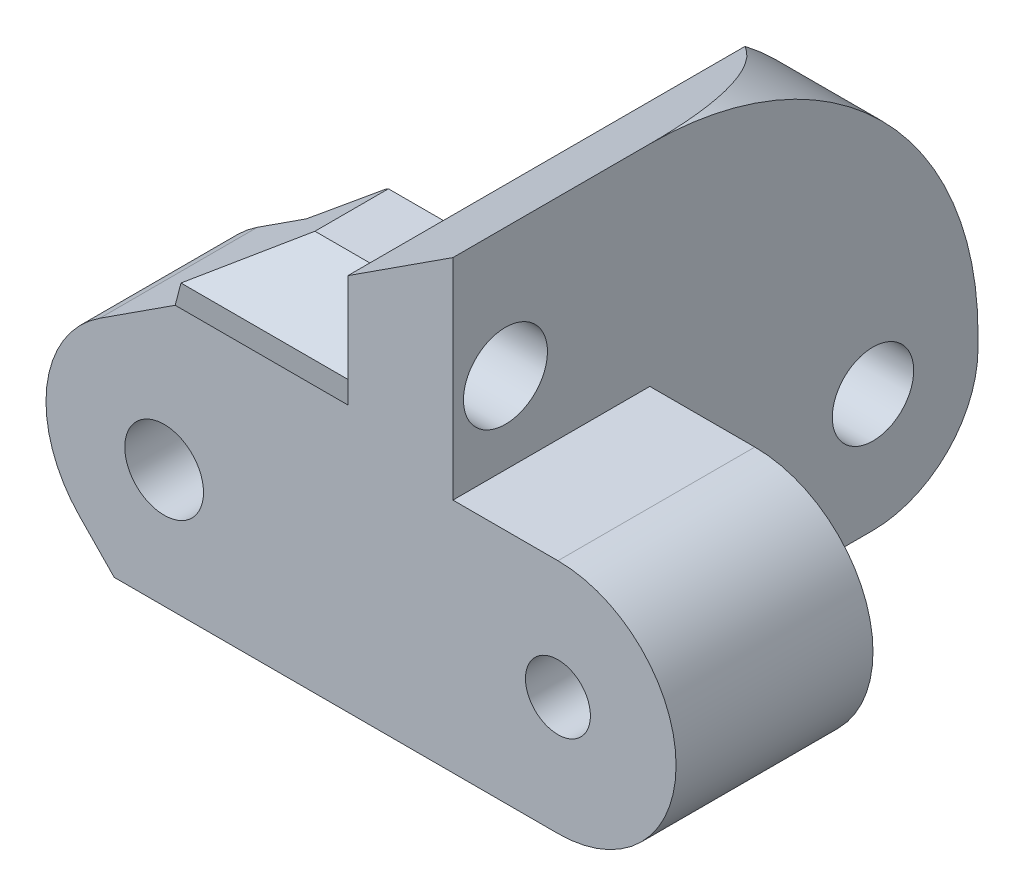
ISO-10303-21;
HEADER;
FILE_DESCRIPTION(('STEP AP214'),'2;1');
FILE_NAME('part.step','',(''),(''),'','','');
FILE_SCHEMA(('AUTOMOTIVE_DESIGN { 1 0 10303 214 1 1 1 1 }'));
ENDSEC;
DATA;
#1=APPLICATION_CONTEXT('core data for automotive mechanical design processes');
#2=APPLICATION_PROTOCOL_DEFINITION('international standard','automotive_design',2000,#1);
#3=PRODUCT_CONTEXT('',#1,'mechanical');
#4=PRODUCT('Part','Part','',(#3));
#5=PRODUCT_RELATED_PRODUCT_CATEGORY('part','',(#4));
#6=PRODUCT_DEFINITION_FORMATION('','',#4);
#7=PRODUCT_DEFINITION_CONTEXT('part definition',#1,'design');
#8=PRODUCT_DEFINITION('design','',#6,#7);
#9=PRODUCT_DEFINITION_SHAPE('','',#8);
#10=(LENGTH_UNIT() NAMED_UNIT(*) SI_UNIT(.MILLI.,.METRE.));
#11=(NAMED_UNIT(*) PLANE_ANGLE_UNIT() SI_UNIT($,.RADIAN.));
#12=(NAMED_UNIT(*) SI_UNIT($,.STERADIAN.) SOLID_ANGLE_UNIT());
#13=UNCERTAINTY_MEASURE_WITH_UNIT(LENGTH_MEASURE(1.E-05),#10,'distance_accuracy_value','');
#14=(GEOMETRIC_REPRESENTATION_CONTEXT(3) GLOBAL_UNCERTAINTY_ASSIGNED_CONTEXT((#13)) GLOBAL_UNIT_ASSIGNED_CONTEXT((#10,
#11,#12)) REPRESENTATION_CONTEXT('',''));
#15=CARTESIAN_POINT('',(0.,0.,0.));
#16=DIRECTION('',(0.,0.,1.));
#17=DIRECTION('',(1.,0.,0.));
#18=AXIS2_PLACEMENT_3D('',#15,#16,#17);
#19=CARTESIAN_POINT('',(15.,0.,20.));
#20=DIRECTION('',(0.,0.,-1.));
#21=DIRECTION('',(-1.,0.,0.));
#22=AXIS2_PLACEMENT_3D('',#19,#20,#21);
#23=CYLINDRICAL_SURFACE('',#22,1.23677362201173);
#24=CARTESIAN_POINT('',(15.,0.,20.));
#25=DIRECTION('',(0.,0.,1.));
#26=DIRECTION('',(1.,0.,0.));
#27=AXIS2_PLACEMENT_3D('',#24,#25,#26);
#28=CIRCLE('',#27,1.23677362201173);
#29=CARTESIAN_POINT('',(16.2367736220117,0.,20.));
#30=VERTEX_POINT('',#29);
#31=EDGE_CURVE('E452',#30,#30,#28,.T.);
#32=ORIENTED_EDGE('',*,*,#31,.T.);
#33=EDGE_LOOP('',(#32));
#34=FACE_BOUND('',#33,.T.);
#35=CARTESIAN_POINT('',(15.,0.,17.));
#36=DIRECTION('',(0.,0.,-1.));
#37=DIRECTION('',(-1.,0.,0.));
#38=AXIS2_PLACEMENT_3D('',#35,#36,#37);
#39=CIRCLE('',#38,1.23677362201173);
#40=CARTESIAN_POINT('',(13.7632263779883,0.,17.));
#41=VERTEX_POINT('',#40);
#42=EDGE_CURVE('E334',#41,#41,#39,.T.);
#43=ORIENTED_EDGE('',*,*,#42,.T.);
#44=EDGE_LOOP('',(#43));
#45=FACE_BOUND('',#44,.T.);
#46=ADVANCED_FACE('F43',(#34,#45),#23,.F.);
#47=CARTESIAN_POINT('',(11.,12.5,20.));
#48=DIRECTION('',(0.544238933358043,-0.838930261355078,0.));
#49=DIRECTION('',(0.838930261355078,0.544238933358043,0.));
#50=AXIS2_PLACEMENT_3D('',#47,#48,#49);
#51=PLANE('',#50);
#52=DIRECTION('',(-0.642711462780688,-0.416945981178167,0.642711462780682));
#53=VECTOR('',#52,1.);
#54=CARTESIAN_POINT('',(-0.683724830096396,4.92042130068163,14.096011589825));
#55=LINE('',#54,#53);
#56=CARTESIAN_POINT('',(0.912286759728581,5.95580133795719,12.5));
#57=VERTEX_POINT('',#56);
#58=CARTESIAN_POINT('',(-0.587713240271441,4.98270686557702,14.));
#59=VERTEX_POINT('',#58);
#60=EDGE_CURVE('E524',#57,#59,#55,.T.);
#61=ORIENTED_EDGE('',*,*,#60,.T.);
#62=DIRECTION('',(-0.838930261355078,-0.544238933358043,0.));
#63=VECTOR('',#62,1.);
#64=CARTESIAN_POINT('',(11.,12.5,14.));
#65=LINE('',#64,#63);
#66=CARTESIAN_POINT('',(-2.44907520011119,3.77518617609785,14.));
#67=VERTEX_POINT('',#66);
#68=EDGE_CURVE('E445',#59,#67,#65,.T.);
#69=ORIENTED_EDGE('',*,*,#68,.T.);
#70=DIRECTION('',(0.,0.,-1.));
#71=VECTOR('',#70,1.);
#72=CARTESIAN_POINT('',(-2.44907520011119,3.77518617609785,20.));
#73=LINE('',#72,#71);
#74=CARTESIAN_POINT('',(-2.44907520011119,3.77518617609785,20.));
#75=VERTEX_POINT('',#74);
#76=EDGE_CURVE('E494',#75,#67,#73,.T.);
#77=ORIENTED_EDGE('',*,*,#76,.F.);
#78=DIRECTION('',(-0.838930261355078,-0.544238933358043,0.));
#79=VECTOR('',#78,1.);
#80=CARTESIAN_POINT('',(11.,12.5,20.));
#81=LINE('',#80,#79);
#82=CARTESIAN_POINT('',(0.420876733903177,5.63700908475527,20.));
#83=VERTEX_POINT('',#82);
#84=EDGE_CURVE('E459',#83,#75,#81,.T.);
#85=ORIENTED_EDGE('',*,*,#84,.F.);
#86=DIRECTION('',(-0.610460041142624,-0.396023527763233,-0.685932871078584));
#87=VECTOR('',#86,1.);
#88=CARTESIAN_POINT('',(6.02248120635965,9.27093598382683,26.2941460201832));
#89=LINE('',#88,#87);
#90=CARTESIAN_POINT('',(-1.35906432704266,4.48230854637602,18.));
#91=VERTEX_POINT('',#90);
#92=EDGE_CURVE('E499',#83,#91,#89,.T.);
#93=ORIENTED_EDGE('',*,*,#92,.T.);
#94=DIRECTION('',(0.610460041142625,0.396023527763233,-0.685932871078584));
#95=VECTOR('',#94,1.);
#96=CARTESIAN_POINT('',(4.34754277156082,8.18435376217362,11.5878695943213));
#97=LINE('',#96,#95);
#98=CARTESIAN_POINT('',(1.04385610523424,6.04115427318801,15.3));
#99=VERTEX_POINT('',#98);
#100=EDGE_CURVE('E506',#91,#99,#97,.T.);
#101=ORIENTED_EDGE('',*,*,#100,.T.);
#102=DIRECTION('',(0.,0.,-1.));
#103=VECTOR('',#102,1.);
#104=CARTESIAN_POINT('',(1.04385610523424,6.04115427318801,20.));
#105=LINE('',#104,#103);
#106=CARTESIAN_POINT('',(1.04385610523425,6.04115427318801,12.5));
#107=VERTEX_POINT('',#106);
#108=EDGE_CURVE('E509',#99,#107,#105,.T.);
#109=ORIENTED_EDGE('',*,*,#108,.T.);
#110=DIRECTION('',(0.838930261355078,0.544238933358043,0.));
#111=VECTOR('',#110,1.);
#112=CARTESIAN_POINT('',(11.,12.5,12.5));
#113=LINE('',#112,#111);
#114=EDGE_CURVE('E375',#57,#107,#113,.T.);
#115=ORIENTED_EDGE('',*,*,#114,.F.);
#116=EDGE_LOOP('',(#61,#69,#77,#85,#93,#101,#109,#115));
#117=FACE_BOUND('',#116,.T.);
#118=ADVANCED_FACE('F558',(#117),#51,.F.);
#119=CARTESIAN_POINT('',(1.58771324027147,-2.75,14.));
#120=DIRECTION('',(0.,-1.,0.));
#121=DIRECTION('',(0.,0.,-1.));
#122=AXIS2_PLACEMENT_3D('',#119,#120,#121);
#123=PLANE('',#122);
#124=DIRECTION('',(1.,0.,0.));
#125=VECTOR('',#124,1.);
#126=CARTESIAN_POINT('',(1.58771324027147,-2.75,12.5));
#127=LINE('',#126,#125);
#128=CARTESIAN_POINT('',(0.912286759728574,-2.75,12.5));
#129=VERTEX_POINT('',#128);
#130=CARTESIAN_POINT('',(1.58771324027147,-2.75,12.5));
#131=VERTEX_POINT('',#130);
#132=EDGE_CURVE('E373',#129,#131,#127,.T.);
#133=ORIENTED_EDGE('',*,*,#132,.F.);
#134=DIRECTION('',(-0.707106781186551,0.,0.707106781186544));
#135=VECTOR('',#134,1.);
#136=CARTESIAN_POINT('',(0.912286759728573,-2.75,12.5));
#137=LINE('',#136,#135);
#138=CARTESIAN_POINT('',(-0.587713240271442,-2.75,14.));
#139=VERTEX_POINT('',#138);
#140=EDGE_CURVE('E520',#129,#139,#137,.T.);
#141=ORIENTED_EDGE('',*,*,#140,.T.);
#142=DIRECTION('',(-1.,0.,0.));
#143=VECTOR('',#142,1.);
#144=CARTESIAN_POINT('',(1.58771324027147,-2.75,14.));
#145=LINE('',#144,#143);
#146=CARTESIAN_POINT('',(1.58771324027147,-2.75,14.));
#147=VERTEX_POINT('',#146);
#148=EDGE_CURVE('E422',#147,#139,#145,.T.);
#149=ORIENTED_EDGE('',*,*,#148,.F.);
#150=DIRECTION('',(0.,0.,-1.));
#151=VECTOR('',#150,1.);
#152=CARTESIAN_POINT('',(1.58771324027147,-2.75,14.));
#153=LINE('',#152,#151);
#154=EDGE_CURVE('E426',#147,#131,#153,.T.);
#155=ORIENTED_EDGE('',*,*,#154,.T.);
#156=EDGE_LOOP('',(#133,#141,#149,#155));
#157=FACE_BOUND('',#156,.T.);
#158=ADVANCED_FACE('F564',(#157),#123,.F.);
#159=CARTESIAN_POINT('',(3.17542648054294,0.,14.));
#160=DIRECTION('',(0.866025403784439,-0.5,0.));
#161=DIRECTION('',(0.5,0.866025403784439,0.));
#162=AXIS2_PLACEMENT_3D('',#159,#160,#161);
#163=PLANE('',#162);
#164=DIRECTION('',(0.5,0.866025403784439,0.));
#165=VECTOR('',#164,1.);
#166=CARTESIAN_POINT('',(3.17542648054294,0.,12.5));
#167=LINE('',#166,#165);
#168=CARTESIAN_POINT('',(3.17542648054294,0.,12.5));
#169=VERTEX_POINT('',#168);
#170=EDGE_CURVE('E371',#131,#169,#167,.T.);
#171=ORIENTED_EDGE('',*,*,#170,.F.);
#172=ORIENTED_EDGE('',*,*,#154,.F.);
#173=DIRECTION('',(-0.5,-0.866025403784439,0.));
#174=VECTOR('',#173,1.);
#175=CARTESIAN_POINT('',(3.17542648054294,0.,14.));
#176=LINE('',#175,#174);
#177=CARTESIAN_POINT('',(3.17542648054294,0.,14.));
#178=VERTEX_POINT('',#177);
#179=EDGE_CURVE('E419',#178,#147,#176,.T.);
#180=ORIENTED_EDGE('',*,*,#179,.F.);
#181=DIRECTION('',(0.,0.,-1.));
#182=VECTOR('',#181,1.);
#183=CARTESIAN_POINT('',(3.17542648054294,0.,14.));
#184=LINE('',#183,#182);
#185=EDGE_CURVE('E430',#178,#169,#184,.T.);
#186=ORIENTED_EDGE('',*,*,#185,.T.);
#187=EDGE_LOOP('',(#171,#172,#180,#186));
#188=FACE_BOUND('',#187,.T.);
#189=ADVANCED_FACE('F641',(#188),#163,.F.);
#190=CARTESIAN_POINT('',(1.58771324027147,2.75,14.));
#191=DIRECTION('',(0.866025403784439,0.5,0.));
#192=DIRECTION('',(-0.5,0.866025403784439,0.));
#193=AXIS2_PLACEMENT_3D('',#190,#191,#192);
#194=PLANE('',#193);
#195=DIRECTION('',(-0.5,0.866025403784439,0.));
#196=VECTOR('',#195,1.);
#197=CARTESIAN_POINT('',(1.58771324027147,2.75,12.5));
#198=LINE('',#197,#196);
#199=CARTESIAN_POINT('',(1.58771324027147,2.75,12.5));
#200=VERTEX_POINT('',#199);
#201=EDGE_CURVE('E369',#169,#200,#198,.T.);
#202=ORIENTED_EDGE('',*,*,#201,.F.);
#203=ORIENTED_EDGE('',*,*,#185,.F.);
#204=DIRECTION('',(0.5,-0.866025403784439,0.));
#205=VECTOR('',#204,1.);
#206=CARTESIAN_POINT('',(1.58771324027147,2.75,14.));
#207=LINE('',#206,#205);
#208=CARTESIAN_POINT('',(1.58771324027147,2.75,14.));
#209=VERTEX_POINT('',#208);
#210=EDGE_CURVE('E416',#209,#178,#207,.T.);
#211=ORIENTED_EDGE('',*,*,#210,.F.);
#212=DIRECTION('',(0.,0.,-1.));
#213=VECTOR('',#212,1.);
#214=CARTESIAN_POINT('',(1.58771324027147,2.75,14.));
#215=LINE('',#214,#213);
#216=EDGE_CURVE('E425',#209,#200,#215,.T.);
#217=ORIENTED_EDGE('',*,*,#216,.T.);
#218=EDGE_LOOP('',(#202,#203,#211,#217));
#219=FACE_BOUND('',#218,.T.);
#220=ADVANCED_FACE('F637',(#219),#194,.F.);
#221=CARTESIAN_POINT('',(-1.58771324027147,2.75,14.));
#222=DIRECTION('',(0.,1.,0.));
#223=DIRECTION('',(-1.,0.,0.));
#224=AXIS2_PLACEMENT_3D('',#221,#222,#223);
#225=PLANE('',#224);
#226=DIRECTION('',(1.,0.,0.));
#227=VECTOR('',#226,1.);
#228=CARTESIAN_POINT('',(-1.58771324027147,2.75,14.));
#229=LINE('',#228,#227);
#230=CARTESIAN_POINT('',(-0.587713240271442,2.75,14.));
#231=VERTEX_POINT('',#230);
#232=EDGE_CURVE('E414',#231,#209,#229,.T.);
#233=ORIENTED_EDGE('',*,*,#232,.F.);
#234=DIRECTION('',(0.707106781186551,0.,-0.707106781186544));
#235=VECTOR('',#234,1.);
#236=CARTESIAN_POINT('',(0.912286759728574,2.75,12.5));
#237=LINE('',#236,#235);
#238=CARTESIAN_POINT('',(0.912286759728573,2.75,12.5));
#239=VERTEX_POINT('',#238);
#240=EDGE_CURVE('E527',#231,#239,#237,.T.);
#241=ORIENTED_EDGE('',*,*,#240,.T.);
#242=DIRECTION('',(-1.,0.,0.));
#243=VECTOR('',#242,1.);
#244=CARTESIAN_POINT('',(-1.58771324027147,2.75,12.5));
#245=LINE('',#244,#243);
#246=EDGE_CURVE('E363',#200,#239,#245,.T.);
#247=ORIENTED_EDGE('',*,*,#246,.F.);
#248=ORIENTED_EDGE('',*,*,#216,.F.);
#249=EDGE_LOOP('',(#233,#241,#247,#248));
#250=FACE_BOUND('',#249,.T.);
#251=ADVANCED_FACE('F581',(#250),#225,.F.);
#252=CARTESIAN_POINT('',(15.,0.,20.));
#253=DIRECTION('',(0.,0.,1.));
#254=DIRECTION('',(1.,0.,0.));
#255=AXIS2_PLACEMENT_3D('',#252,#253,#254);
#256=PLANE('',#255);
#257=DIRECTION('',(1.,0.,0.));
#258=VECTOR('',#257,1.);
#259=CARTESIAN_POINT('',(-4.5,5.63700908475527,20.));
#260=LINE('',#259,#258);
#261=CARTESIAN_POINT('',(7.,5.63700908475527,20.));
#262=VERTEX_POINT('',#261);
#263=EDGE_CURVE('E405',#83,#262,#260,.T.);
#264=ORIENTED_EDGE('',*,*,#263,.F.);
#265=ORIENTED_EDGE('',*,*,#84,.T.);
#266=CARTESIAN_POINT('',(0.,0.,20.));
#267=DIRECTION('',(0.,0.,1.));
#268=DIRECTION('',(1.,0.,0.));
#269=AXIS2_PLACEMENT_3D('',#266,#267,#268);
#270=CIRCLE('',#269,4.5);
#271=CARTESIAN_POINT('',(-3.22716747151166,-3.13614255269385,20.));
#272=VERTEX_POINT('',#271);
#273=EDGE_CURVE('E463',#75,#272,#270,.T.);
#274=ORIENTED_EDGE('',*,*,#273,.T.);
#275=DIRECTION('',(0.696920567265299,-0.71714832700259,0.));
#276=VECTOR('',#275,1.);
#277=CARTESIAN_POINT('',(-3.22716747151166,-3.13614255269385,20.));
#278=LINE('',#277,#276);
#279=CARTESIAN_POINT('',(-1.90177874778927,-4.5,20.));
#280=VERTEX_POINT('',#279);
#281=EDGE_CURVE('E466',#272,#280,#278,.T.);
#282=ORIENTED_EDGE('',*,*,#281,.T.);
#283=DIRECTION('',(1.,0.,0.));
#284=VECTOR('',#283,1.);
#285=CARTESIAN_POINT('',(-1.90177874778927,-4.5,20.));
#286=LINE('',#285,#284);
#287=CARTESIAN_POINT('',(15.,-4.5,20.));
#288=VERTEX_POINT('',#287);
#289=EDGE_CURVE('E468',#280,#288,#286,.T.);
#290=ORIENTED_EDGE('',*,*,#289,.T.);
#291=CARTESIAN_POINT('',(15.,0.,20.));
#292=DIRECTION('',(0.,0.,1.));
#293=DIRECTION('',(1.,0.,0.));
#294=AXIS2_PLACEMENT_3D('',#291,#292,#293);
#295=CIRCLE('',#294,4.5);
#296=CARTESIAN_POINT('',(15.,4.5,20.));
#297=VERTEX_POINT('',#296);
#298=EDGE_CURVE('E471',#288,#297,#295,.T.);
#299=ORIENTED_EDGE('',*,*,#298,.T.);
#300=DIRECTION('',(-1.,0.,0.));
#301=VECTOR('',#300,1.);
#302=CARTESIAN_POINT('',(15.,4.5,20.));
#303=LINE('',#302,#301);
#304=CARTESIAN_POINT('',(11.,4.5,20.));
#305=VERTEX_POINT('',#304);
#306=EDGE_CURVE('E473',#297,#305,#303,.T.);
#307=ORIENTED_EDGE('',*,*,#306,.T.);
#308=DIRECTION('',(0.,1.,0.));
#309=VECTOR('',#308,1.);
#310=CARTESIAN_POINT('',(11.,12.5,20.));
#311=LINE('',#310,#309);
#312=CARTESIAN_POINT('',(11.,12.5,20.));
#313=VERTEX_POINT('',#312);
#314=EDGE_CURVE('E260',#305,#313,#311,.T.);
#315=ORIENTED_EDGE('',*,*,#314,.T.);
#316=CARTESIAN_POINT('',(7.,9.90508140698625,20.));
#317=VERTEX_POINT('',#316);
#318=EDGE_CURVE('E460',#313,#317,#81,.T.);
#319=ORIENTED_EDGE('',*,*,#318,.T.);
#320=DIRECTION('',(0.,-1.,0.));
#321=VECTOR('',#320,1.);
#322=CARTESIAN_POINT('',(7.,11.8723919920032,20.));
#323=LINE('',#322,#321);
#324=EDGE_CURVE('E393',#317,#262,#323,.T.);
#325=ORIENTED_EDGE('',*,*,#324,.T.);
#326=EDGE_LOOP('',(#264,#265,#274,#282,#290,#299,#307,#315,#319,#325));
#327=FACE_BOUND('',#326,.T.);
#328=CARTESIAN_POINT('',(0.,0.,20.));
#329=DIRECTION('',(0.,0.,1.));
#330=DIRECTION('',(1.,0.,0.));
#331=AXIS2_PLACEMENT_3D('',#328,#329,#330);
#332=CIRCLE('',#331,1.5);
#333=CARTESIAN_POINT('',(1.5,0.,20.));
#334=VERTEX_POINT('',#333);
#335=EDGE_CURVE('E261',#334,#334,#332,.T.);
#336=ORIENTED_EDGE('',*,*,#335,.F.);
#337=EDGE_LOOP('',(#336));
#338=FACE_BOUND('',#337,.T.);
#339=ORIENTED_EDGE('',*,*,#31,.F.);
#340=EDGE_LOOP('',(#339));
#341=FACE_BOUND('',#340,.T.);
#342=ADVANCED_FACE('F578',(#327,#338,#341),#256,.T.);
#343=CARTESIAN_POINT('',(15.,0.,0.));
#344=DIRECTION('',(0.,0.,1.));
#345=DIRECTION('',(1.,0.,0.));
#346=AXIS2_PLACEMENT_3D('',#343,#344,#345);
#347=PLANE('',#346);
#348=DIRECTION('',(0.,1.,0.));
#349=VECTOR('',#348,1.);
#350=CARTESIAN_POINT('',(11.,12.5,0.));
#351=LINE('',#350,#349);
#352=CARTESIAN_POINT('',(11.,-0.5,0.));
#353=VERTEX_POINT('',#352);
#354=CARTESIAN_POINT('',(11.,0.,0.));
#355=VERTEX_POINT('',#354);
#356=EDGE_CURVE('E253',#353,#355,#351,.T.);
#357=ORIENTED_EDGE('',*,*,#356,.F.);
#358=DIRECTION('',(1.,0.,0.));
#359=VECTOR('',#358,1.);
#360=CARTESIAN_POINT('',(15.,-0.5,0.));
#361=LINE('',#360,#359);
#362=CARTESIAN_POINT('',(5.5,-0.5,0.));
#363=VERTEX_POINT('',#362);
#364=EDGE_CURVE('E58',#353,#363,#361,.F.);
#365=ORIENTED_EDGE('',*,*,#364,.T.);
#366=DIRECTION('',(0.,-1.,0.));
#367=VECTOR('',#366,1.);
#368=CARTESIAN_POINT('',(5.5,6.04115427318802,0.));
#369=LINE('',#368,#367);
#370=CARTESIAN_POINT('',(5.5,0.,0.));
#371=VERTEX_POINT('',#370);
#372=EDGE_CURVE('E273',#371,#363,#369,.T.);
#373=ORIENTED_EDGE('',*,*,#372,.F.);
#374=DIRECTION('',(-1.,0.,0.));
#375=VECTOR('',#374,1.);
#376=CARTESIAN_POINT('',(19.5,0.,0.));
#377=LINE('',#376,#375);
#378=EDGE_CURVE('E265',#355,#371,#377,.T.);
#379=ORIENTED_EDGE('',*,*,#378,.F.);
#380=EDGE_LOOP('',(#357,#365,#373,#379));
#381=FACE_BOUND('',#380,.T.);
#382=ADVANCED_FACE('F272',(#381),#347,.F.);
#383=CARTESIAN_POINT('',(11.,12.5,20.));
#384=DIRECTION('',(-1.,0.,0.));
#385=DIRECTION('',(0.,-1.,0.));
#386=AXIS2_PLACEMENT_3D('',#383,#384,#385);
#387=PLANE('',#386);
#388=CARTESIAN_POINT('',(11.,0.,4.));
#389=DIRECTION('',(-1.,0.,0.));
#390=DIRECTION('',(0.,-1.,0.));
#391=AXIS2_PLACEMENT_3D('',#388,#389,#390);
#392=CIRCLE('',#391,1.55);
#393=CARTESIAN_POINT('',(11.,-1.55,4.));
#394=VERTEX_POINT('',#393);
#395=EDGE_CURVE('E280',#394,#394,#392,.T.);
#396=ORIENTED_EDGE('',*,*,#395,.T.);
#397=EDGE_LOOP('',(#396));
#398=FACE_BOUND('',#397,.T.);
#399=CARTESIAN_POINT('',(11.,7.6,18.));
#400=DIRECTION('',(1.,0.,0.));
#401=DIRECTION('',(0.,1.,0.));
#402=AXIS2_PLACEMENT_3D('',#399,#400,#401);
#403=CIRCLE('',#402,1.6);
#404=CARTESIAN_POINT('',(11.,9.2,18.));
#405=VERTEX_POINT('',#404);
#406=EDGE_CURVE('E448',#405,#405,#403,.T.);
#407=ORIENTED_EDGE('',*,*,#406,.F.);
#408=EDGE_LOOP('',(#407));
#409=FACE_BOUND('',#408,.T.);
#410=DIRECTION('',(0.,0.,-1.));
#411=VECTOR('',#410,1.);
#412=CARTESIAN_POINT('',(11.,-4.5,12.5));
#413=LINE('',#412,#411);
#414=CARTESIAN_POINT('',(11.,-4.5,12.5));
#415=VERTEX_POINT('',#414);
#416=CARTESIAN_POINT('',(11.,-4.5,4.));
#417=VERTEX_POINT('',#416);
#418=EDGE_CURVE('E387',#415,#417,#413,.T.);
#419=ORIENTED_EDGE('',*,*,#418,.T.);
#420=CARTESIAN_POINT('',(11.,-0.5,4.));
#421=DIRECTION('',(-1.,0.,0.));
#422=DIRECTION('',(0.,-1.,0.));
#423=AXIS2_PLACEMENT_3D('',#420,#421,#422);
#424=CIRCLE('',#423,4.);
#425=EDGE_CURVE('E66',#417,#353,#424,.F.);
#426=ORIENTED_EDGE('',*,*,#425,.T.);
#427=ORIENTED_EDGE('',*,*,#356,.T.);
#428=CARTESIAN_POINT('',(11.,0.,12.5));
#429=DIRECTION('',(-1.,0.,0.));
#430=DIRECTION('',(0.,-1.,0.));
#431=AXIS2_PLACEMENT_3D('',#428,#429,#430);
#432=CIRCLE('',#431,12.5);
#433=CARTESIAN_POINT('',(11.,12.5,12.5));
#434=VERTEX_POINT('',#433);
#435=EDGE_CURVE('E257',#355,#434,#432,.F.);
#436=ORIENTED_EDGE('',*,*,#435,.T.);
#437=DIRECTION('',(0.,0.,-1.));
#438=VECTOR('',#437,1.);
#439=CARTESIAN_POINT('',(11.,12.5,20.));
#440=LINE('',#439,#438);
#441=EDGE_CURVE('E497',#313,#434,#440,.T.);
#442=ORIENTED_EDGE('',*,*,#441,.F.);
#443=ORIENTED_EDGE('',*,*,#314,.F.);
#444=DIRECTION('',(0.,0.,-1.));
#445=VECTOR('',#444,1.);
#446=CARTESIAN_POINT('',(11.,4.5,20.));
#447=LINE('',#446,#445);
#448=CARTESIAN_POINT('',(11.,4.5,12.5));
#449=VERTEX_POINT('',#448);
#450=EDGE_CURVE('E474',#305,#449,#447,.T.);
#451=ORIENTED_EDGE('',*,*,#450,.T.);
#452=DIRECTION('',(0.,1.,0.));
#453=VECTOR('',#452,1.);
#454=CARTESIAN_POINT('',(11.,4.5,12.5));
#455=LINE('',#454,#453);
#456=EDGE_CURVE('E377',#415,#449,#455,.T.);
#457=ORIENTED_EDGE('',*,*,#456,.F.);
#458=EDGE_LOOP('',(#419,#426,#427,#436,#442,#443,#451,#457));
#459=FACE_BOUND('',#458,.T.);
#460=ADVANCED_FACE('F255',(#398,#409,#459),#387,.F.);
#461=ORIENTED_EDGE('',*,*,#441,.T.);
#462=CARTESIAN_POINT('',(-8.26842720022668,0.,12.5));
#463=DIRECTION('',(0.544238933358043,-0.838930261355078,0.));
#464=DIRECTION('',(-0.838930261355078,-0.544238933358043,0.));
#465=AXIS2_PLACEMENT_3D('',#462,#463,#464);
#466=ELLIPSE('',#465,22.967853333963,12.5);
#467=CARTESIAN_POINT('',(7.,9.90508140698625,4.87508279907413));
#468=VERTEX_POINT('',#467);
#469=EDGE_CURVE('E268',#434,#468,#466,.F.);
#470=ORIENTED_EDGE('',*,*,#469,.T.);
#471=DIRECTION('',(0.,0.,1.));
#472=VECTOR('',#471,1.);
#473=CARTESIAN_POINT('',(7.,9.90508140698625,20.));
#474=LINE('',#473,#472);
#475=EDGE_CURVE('E412',#468,#317,#474,.T.);
#476=ORIENTED_EDGE('',*,*,#475,.T.);
#477=ORIENTED_EDGE('',*,*,#318,.F.);
#478=EDGE_LOOP('',(#461,#470,#476,#477));
#479=FACE_BOUND('',#478,.T.);
#480=ADVANCED_FACE('F567',(#479),#51,.F.);
#481=CARTESIAN_POINT('',(0.,0.,20.));
#482=DIRECTION('',(0.,0.,-1.));
#483=DIRECTION('',(-1.,0.,0.));
#484=AXIS2_PLACEMENT_3D('',#481,#482,#483);
#485=CYLINDRICAL_SURFACE('',#484,4.5);
#486=ORIENTED_EDGE('',*,*,#76,.T.);
#487=CARTESIAN_POINT('',(0.,0.,14.));
#488=DIRECTION('',(0.,0.,1.));
#489=DIRECTION('',(1.,0.,0.));
#490=AXIS2_PLACEMENT_3D('',#487,#488,#489);
#491=CIRCLE('',#490,4.5);
#492=CARTESIAN_POINT('',(-3.22716747151166,-3.13614255269385,14.));
#493=VERTEX_POINT('',#492);
#494=EDGE_CURVE('E441',#67,#493,#491,.T.);
#495=ORIENTED_EDGE('',*,*,#494,.T.);
#496=DIRECTION('',(0.,0.,-1.));
#497=VECTOR('',#496,1.);
#498=CARTESIAN_POINT('',(-3.22716747151166,-3.13614255269385,20.));
#499=LINE('',#498,#497);
#500=EDGE_CURVE('E490',#272,#493,#499,.T.);
#501=ORIENTED_EDGE('',*,*,#500,.F.);
#502=ORIENTED_EDGE('',*,*,#273,.F.);
#503=EDGE_LOOP('',(#486,#495,#501,#502));
#504=FACE_BOUND('',#503,.T.);
#505=ADVANCED_FACE('F599',(#504),#485,.T.);
#506=CARTESIAN_POINT('',(-3.22716747151166,-3.13614255269385,20.));
#507=DIRECTION('',(0.71714832700259,0.696920567265299,0.));
#508=DIRECTION('',(-0.696920567265299,0.71714832700259,0.));
#509=AXIS2_PLACEMENT_3D('',#506,#507,#508);
#510=PLANE('',#509);
#511=ORIENTED_EDGE('',*,*,#500,.T.);
#512=DIRECTION('',(0.696920567265299,-0.71714832700259,0.));
#513=VECTOR('',#512,1.);
#514=CARTESIAN_POINT('',(-3.22716747151166,-3.13614255269385,14.));
#515=LINE('',#514,#513);
#516=CARTESIAN_POINT('',(-1.90177874778927,-4.5,14.));
#517=VERTEX_POINT('',#516);
#518=EDGE_CURVE('E437',#493,#517,#515,.T.);
#519=ORIENTED_EDGE('',*,*,#518,.T.);
#520=DIRECTION('',(0.,0.,-1.));
#521=VECTOR('',#520,1.);
#522=CARTESIAN_POINT('',(-1.90177874778927,-4.5,20.));
#523=LINE('',#522,#521);
#524=EDGE_CURVE('E487',#280,#517,#523,.T.);
#525=ORIENTED_EDGE('',*,*,#524,.F.);
#526=ORIENTED_EDGE('',*,*,#281,.F.);
#527=EDGE_LOOP('',(#511,#519,#525,#526));
#528=FACE_BOUND('',#527,.T.);
#529=ADVANCED_FACE('F595',(#528),#510,.F.);
#530=CARTESIAN_POINT('',(-1.90177874778927,-4.5,20.));
#531=DIRECTION('',(0.,1.,0.));
#532=DIRECTION('',(0.,0.,1.));
#533=AXIS2_PLACEMENT_3D('',#530,#531,#532);
#534=PLANE('',#533);
#535=DIRECTION('',(0.,0.,-1.));
#536=VECTOR('',#535,1.);
#537=CARTESIAN_POINT('',(5.5,-4.5,12.5));
#538=LINE('',#537,#536);
#539=CARTESIAN_POINT('',(5.5,-4.5,12.5));
#540=VERTEX_POINT('',#539);
#541=CARTESIAN_POINT('',(5.5,-4.5,4.));
#542=VERTEX_POINT('',#541);
#543=EDGE_CURVE('E358',#540,#542,#538,.T.);
#544=ORIENTED_EDGE('',*,*,#543,.T.);
#545=DIRECTION('',(1.,0.,0.));
#546=VECTOR('',#545,1.);
#547=CARTESIAN_POINT('',(-1.90177874778927,-4.5,4.));
#548=LINE('',#547,#546);
#549=EDGE_CURVE('E534',#542,#417,#548,.T.);
#550=ORIENTED_EDGE('',*,*,#549,.T.);
#551=ORIENTED_EDGE('',*,*,#418,.F.);
#552=DIRECTION('',(-1.,0.,0.));
#553=VECTOR('',#552,1.);
#554=CARTESIAN_POINT('',(11.,-4.5,12.5));
#555=LINE('',#554,#553);
#556=CARTESIAN_POINT('',(15.,-4.5,12.5));
#557=VERTEX_POINT('',#556);
#558=EDGE_CURVE('E384',#557,#415,#555,.T.);
#559=ORIENTED_EDGE('',*,*,#558,.F.);
#560=DIRECTION('',(0.,0.,-1.));
#561=VECTOR('',#560,1.);
#562=CARTESIAN_POINT('',(15.,-4.5,20.));
#563=LINE('',#562,#561);
#564=EDGE_CURVE('E483',#288,#557,#563,.T.);
#565=ORIENTED_EDGE('',*,*,#564,.F.);
#566=ORIENTED_EDGE('',*,*,#289,.F.);
#567=ORIENTED_EDGE('',*,*,#524,.T.);
#568=DIRECTION('',(1.,0.,0.));
#569=VECTOR('',#568,1.);
#570=CARTESIAN_POINT('',(-1.90177874778927,-4.5,14.));
#571=LINE('',#570,#569);
#572=CARTESIAN_POINT('',(-0.587713240271441,-4.5,14.));
#573=VERTEX_POINT('',#572);
#574=EDGE_CURVE('E435',#517,#573,#571,.T.);
#575=ORIENTED_EDGE('',*,*,#574,.T.);
#576=DIRECTION('',(0.707106781186551,0.,-0.707106781186544));
#577=VECTOR('',#576,1.);
#578=CARTESIAN_POINT('',(0.912286759728573,-4.5,12.5));
#579=LINE('',#578,#577);
#580=CARTESIAN_POINT('',(0.912286759728574,-4.5,12.5));
#581=VERTEX_POINT('',#580);
#582=EDGE_CURVE('E522',#573,#581,#579,.T.);
#583=ORIENTED_EDGE('',*,*,#582,.T.);
#584=DIRECTION('',(-1.,0.,0.));
#585=VECTOR('',#584,1.);
#586=CARTESIAN_POINT('',(5.5,-4.5,12.5));
#587=LINE('',#586,#585);
#588=EDGE_CURVE('E354',#540,#581,#587,.T.);
#589=ORIENTED_EDGE('',*,*,#588,.F.);
#590=EDGE_LOOP('',(#544,#550,#551,#559,#565,#566,#567,#575,#583,#589));
#591=FACE_BOUND('',#590,.T.);
#592=ADVANCED_FACE('F591',(#591),#534,.F.);
#593=CARTESIAN_POINT('',(15.,0.,20.));
#594=DIRECTION('',(0.,0.,-1.));
#595=DIRECTION('',(-1.,0.,0.));
#596=AXIS2_PLACEMENT_3D('',#593,#594,#595);
#597=CYLINDRICAL_SURFACE('',#596,4.5);
#598=CARTESIAN_POINT('',(15.,0.,12.5));
#599=DIRECTION('',(0.,0.,1.));
#600=DIRECTION('',(1.,0.,0.));
#601=AXIS2_PLACEMENT_3D('',#598,#599,#600);
#602=CIRCLE('',#601,4.5);
#603=CARTESIAN_POINT('',(15.,4.5,12.5));
#604=VERTEX_POINT('',#603);
#605=EDGE_CURVE('E390',#557,#604,#602,.T.);
#606=ORIENTED_EDGE('',*,*,#605,.T.);
#607=DIRECTION('',(0.,0.,-1.));
#608=VECTOR('',#607,1.);
#609=CARTESIAN_POINT('',(15.,4.5,20.));
#610=LINE('',#609,#608);
#611=EDGE_CURVE('E479',#297,#604,#610,.T.);
#612=ORIENTED_EDGE('',*,*,#611,.F.);
#613=ORIENTED_EDGE('',*,*,#298,.F.);
#614=ORIENTED_EDGE('',*,*,#564,.T.);
#615=EDGE_LOOP('',(#606,#612,#613,#614));
#616=FACE_BOUND('',#615,.T.);
#617=ADVANCED_FACE('F587',(#616),#597,.T.);
#618=CARTESIAN_POINT('',(15.,4.5,20.));
#619=DIRECTION('',(0.,-1.,0.));
#620=DIRECTION('',(1.,0.,0.));
#621=AXIS2_PLACEMENT_3D('',#618,#619,#620);
#622=PLANE('',#621);
#623=ORIENTED_EDGE('',*,*,#611,.T.);
#624=DIRECTION('',(1.,0.,0.));
#625=VECTOR('',#624,1.);
#626=CARTESIAN_POINT('',(11.,4.5,12.5));
#627=LINE('',#626,#625);
#628=EDGE_CURVE('E380',#449,#604,#627,.T.);
#629=ORIENTED_EDGE('',*,*,#628,.F.);
#630=ORIENTED_EDGE('',*,*,#450,.F.);
#631=ORIENTED_EDGE('',*,*,#306,.F.);
#632=EDGE_LOOP('',(#623,#629,#630,#631));
#633=FACE_BOUND('',#632,.T.);
#634=ADVANCED_FACE('F576',(#633),#622,.F.);
#635=CARTESIAN_POINT('',(0.,0.,20.));
#636=DIRECTION('',(0.,0.,-1.));
#637=DIRECTION('',(-1.,0.,0.));
#638=AXIS2_PLACEMENT_3D('',#635,#636,#637);
#639=CYLINDRICAL_SURFACE('',#638,1.5);
#640=CARTESIAN_POINT('',(0.,0.,14.));
#641=DIRECTION('',(0.,0.,1.));
#642=DIRECTION('',(1.,0.,0.));
#643=AXIS2_PLACEMENT_3D('',#640,#641,#642);
#644=CIRCLE('',#643,1.5);
#645=CARTESIAN_POINT('',(1.5,0.,14.));
#646=VERTEX_POINT('',#645);
#647=EDGE_CURVE('E429',#646,#646,#644,.T.);
#648=ORIENTED_EDGE('',*,*,#647,.F.);
#649=EDGE_LOOP('',(#648));
#650=FACE_BOUND('',#649,.T.);
#651=ORIENTED_EDGE('',*,*,#335,.T.);
#652=EDGE_LOOP('',(#651));
#653=FACE_BOUND('',#652,.T.);
#654=ADVANCED_FACE('F573',(#650,#653),#639,.F.);
#655=CARTESIAN_POINT('',(-4.5,7.6,18.));
#656=DIRECTION('',(1.,0.,0.));
#657=DIRECTION('',(0.,1.,0.));
#658=AXIS2_PLACEMENT_3D('',#655,#656,#657);
#659=CYLINDRICAL_SURFACE('',#658,1.6);
#660=CARTESIAN_POINT('',(7.,7.6,18.));
#661=DIRECTION('',(1.,0.,0.));
#662=DIRECTION('',(0.,0.,-1.));
#663=AXIS2_PLACEMENT_3D('',#660,#661,#662);
#664=CIRCLE('',#663,1.6);
#665=CARTESIAN_POINT('',(7.,7.6,16.4));
#666=VERTEX_POINT('',#665);
#667=EDGE_CURVE('E408',#666,#666,#664,.F.);
#668=ORIENTED_EDGE('',*,*,#667,.T.);
#669=EDGE_LOOP('',(#668));
#670=FACE_BOUND('',#669,.T.);
#671=ORIENTED_EDGE('',*,*,#406,.T.);
#672=EDGE_LOOP('',(#671));
#673=FACE_BOUND('',#672,.T.);
#674=ADVANCED_FACE('F571',(#670,#673),#659,.F.);
#675=CARTESIAN_POINT('',(0.,0.,14.));
#676=DIRECTION('',(0.,0.,1.));
#677=DIRECTION('',(1.,0.,0.));
#678=AXIS2_PLACEMENT_3D('',#675,#676,#677);
#679=PLANE('',#678);
#680=ORIENTED_EDGE('',*,*,#647,.T.);
#681=EDGE_LOOP('',(#680));
#682=FACE_BOUND('',#681,.T.);
#683=ORIENTED_EDGE('',*,*,#68,.F.);
#684=DIRECTION('',(0.,-1.,0.));
#685=VECTOR('',#684,1.);
#686=CARTESIAN_POINT('',(-0.587713240271441,0.,14.));
#687=LINE('',#686,#685);
#688=EDGE_CURVE('E532',#59,#231,#687,.T.);
#689=ORIENTED_EDGE('',*,*,#688,.T.);
#690=ORIENTED_EDGE('',*,*,#232,.T.);
#691=ORIENTED_EDGE('',*,*,#210,.T.);
#692=ORIENTED_EDGE('',*,*,#179,.T.);
#693=ORIENTED_EDGE('',*,*,#148,.T.);
#694=DIRECTION('',(0.,-1.,0.));
#695=VECTOR('',#694,1.);
#696=CARTESIAN_POINT('',(-0.587713240271442,0.,14.));
#697=LINE('',#696,#695);
#698=EDGE_CURVE('E529',#139,#573,#697,.T.);
#699=ORIENTED_EDGE('',*,*,#698,.T.);
#700=ORIENTED_EDGE('',*,*,#574,.F.);
#701=ORIENTED_EDGE('',*,*,#518,.F.);
#702=ORIENTED_EDGE('',*,*,#494,.F.);
#703=EDGE_LOOP('',(#683,#689,#690,#691,#692,#693,#699,#700,#701,#702));
#704=FACE_BOUND('',#703,.T.);
#705=ADVANCED_FACE('F644',(#682,#704),#679,.F.);
#706=CARTESIAN_POINT('',(-4.5,6.04115427318801,15.3));
#707=DIRECTION('',(0.,-1.,0.));
#708=DIRECTION('',(0.,0.,-1.));
#709=AXIS2_PLACEMENT_3D('',#706,#707,#708);
#710=PLANE('',#709);
#711=DIRECTION('',(0.,0.,-1.));
#712=VECTOR('',#711,1.);
#713=CARTESIAN_POINT('',(7.,6.04115427318801,15.3));
#714=LINE('',#713,#712);
#715=CARTESIAN_POINT('',(7.,6.04115427318801,15.3));
#716=VERTEX_POINT('',#715);
#717=CARTESIAN_POINT('',(7.,6.04115427318802,1.55676213145569));
#718=VERTEX_POINT('',#717);
#719=EDGE_CURVE('E402',#716,#718,#714,.T.);
#720=ORIENTED_EDGE('',*,*,#719,.T.);
#721=DIRECTION('',(-1.,0.,0.));
#722=VECTOR('',#721,1.);
#723=CARTESIAN_POINT('',(19.5,6.04115427318801,1.55676213145569));
#724=LINE('',#723,#722);
#725=CARTESIAN_POINT('',(5.5,6.04115427318802,1.55676213145569));
#726=VERTEX_POINT('',#725);
#727=EDGE_CURVE('E278',#718,#726,#724,.T.);
#728=ORIENTED_EDGE('',*,*,#727,.T.);
#729=DIRECTION('',(0.,0.,-1.));
#730=VECTOR('',#729,1.);
#731=CARTESIAN_POINT('',(5.5,6.04115427318802,12.5));
#732=LINE('',#731,#730);
#733=CARTESIAN_POINT('',(5.5,6.04115427318802,12.5));
#734=VERTEX_POINT('',#733);
#735=EDGE_CURVE('E360',#734,#726,#732,.T.);
#736=ORIENTED_EDGE('',*,*,#735,.F.);
#737=DIRECTION('',(1.,0.,0.));
#738=VECTOR('',#737,1.);
#739=CARTESIAN_POINT('',(-4.5,6.04115427318802,12.5));
#740=LINE('',#739,#738);
#741=EDGE_CURVE('E512',#107,#734,#740,.T.);
#742=ORIENTED_EDGE('',*,*,#741,.F.);
#743=ORIENTED_EDGE('',*,*,#108,.F.);
#744=DIRECTION('',(1.,0.,0.));
#745=VECTOR('',#744,1.);
#746=CARTESIAN_POINT('',(-4.5,6.04115427318801,15.3));
#747=LINE('',#746,#745);
#748=EDGE_CURVE('E406',#99,#716,#747,.T.);
#749=ORIENTED_EDGE('',*,*,#748,.T.);
#750=EDGE_LOOP('',(#720,#728,#736,#742,#743,#749));
#751=FACE_BOUND('',#750,.T.);
#752=ADVANCED_FACE('F650',(#751),#710,.F.);
#753=CARTESIAN_POINT('',(-4.5,4.48230854637602,18.));
#754=DIRECTION('',(0.,-0.866025403784439,-0.5));
#755=DIRECTION('',(0.,0.5,-0.866025403784439));
#756=AXIS2_PLACEMENT_3D('',#753,#754,#755);
#757=PLANE('',#756);
#758=DIRECTION('',(1.,0.,0.));
#759=VECTOR('',#758,1.);
#760=CARTESIAN_POINT('',(-4.5,4.48230854637602,18.));
#761=LINE('',#760,#759);
#762=CARTESIAN_POINT('',(7.,4.48230854637602,18.));
#763=VERTEX_POINT('',#762);
#764=EDGE_CURVE('E409',#91,#763,#761,.T.);
#765=ORIENTED_EDGE('',*,*,#764,.T.);
#766=DIRECTION('',(0.,0.5,-0.866025403784439));
#767=VECTOR('',#766,1.);
#768=CARTESIAN_POINT('',(7.,4.48230854637602,18.));
#769=LINE('',#768,#767);
#770=EDGE_CURVE('E399',#763,#716,#769,.T.);
#771=ORIENTED_EDGE('',*,*,#770,.T.);
#772=ORIENTED_EDGE('',*,*,#748,.F.);
#773=ORIENTED_EDGE('',*,*,#100,.F.);
#774=EDGE_LOOP('',(#765,#771,#772,#773));
#775=FACE_BOUND('',#774,.T.);
#776=ADVANCED_FACE('F683',(#775),#757,.F.);
#777=CARTESIAN_POINT('',(-4.5,5.63700908475527,20.));
#778=DIRECTION('',(0.,-0.866025403784439,0.499999999999999));
#779=DIRECTION('',(0.,-0.5,-0.866025403784439));
#780=AXIS2_PLACEMENT_3D('',#777,#778,#779);
#781=PLANE('',#780);
#782=ORIENTED_EDGE('',*,*,#263,.T.);
#783=DIRECTION('',(0.,-0.5,-0.866025403784439));
#784=VECTOR('',#783,1.);
#785=CARTESIAN_POINT('',(7.,5.63700908475527,20.));
#786=LINE('',#785,#784);
#787=EDGE_CURVE('E396',#262,#763,#786,.T.);
#788=ORIENTED_EDGE('',*,*,#787,.T.);
#789=ORIENTED_EDGE('',*,*,#764,.F.);
#790=ORIENTED_EDGE('',*,*,#92,.F.);
#791=EDGE_LOOP('',(#782,#788,#789,#790));
#792=FACE_BOUND('',#791,.T.);
#793=ADVANCED_FACE('F674',(#792),#781,.F.);
#794=CARTESIAN_POINT('',(7.,0.,0.));
#795=DIRECTION('',(1.,0.,0.));
#796=DIRECTION('',(0.,0.,-1.));
#797=AXIS2_PLACEMENT_3D('',#794,#795,#796);
#798=PLANE('',#797);
#799=ORIENTED_EDGE('',*,*,#667,.F.);
#800=EDGE_LOOP('',(#799));
#801=FACE_BOUND('',#800,.T.);
#802=ORIENTED_EDGE('',*,*,#475,.F.);
#803=CARTESIAN_POINT('',(7.,0.,12.5));
#804=DIRECTION('',(1.,0.,0.));
#805=DIRECTION('',(0.,0.,-1.));
#806=AXIS2_PLACEMENT_3D('',#803,#804,#805);
#807=CIRCLE('',#806,12.5);
#808=EDGE_CURVE('E274',#468,#718,#807,.F.);
#809=ORIENTED_EDGE('',*,*,#808,.T.);
#810=ORIENTED_EDGE('',*,*,#719,.F.);
#811=ORIENTED_EDGE('',*,*,#770,.F.);
#812=ORIENTED_EDGE('',*,*,#787,.F.);
#813=ORIENTED_EDGE('',*,*,#324,.F.);
#814=EDGE_LOOP('',(#802,#809,#810,#811,#812,#813));
#815=FACE_BOUND('',#814,.T.);
#816=ADVANCED_FACE('F679',(#801,#815),#798,.F.);
#817=CARTESIAN_POINT('',(0.,0.,12.5));
#818=DIRECTION('',(0.,0.,1.));
#819=DIRECTION('',(1.,0.,0.));
#820=AXIS2_PLACEMENT_3D('',#817,#818,#819);
#821=PLANE('',#820);
#822=DIRECTION('',(0.,1.,0.));
#823=VECTOR('',#822,1.);
#824=CARTESIAN_POINT('',(12.2,-1.61658075373095,12.5));
#825=LINE('',#824,#823);
#826=CARTESIAN_POINT('',(12.2,-1.61658075373095,12.5));
#827=VERTEX_POINT('',#826);
#828=CARTESIAN_POINT('',(12.2,1.61658075373095,12.5));
#829=VERTEX_POINT('',#828);
#830=EDGE_CURVE('E312',#827,#829,#825,.T.);
#831=ORIENTED_EDGE('',*,*,#830,.F.);
#832=DIRECTION('',(-0.866025403784438,0.5,0.));
#833=VECTOR('',#832,1.);
#834=CARTESIAN_POINT('',(15.,-3.23316150746191,12.5));
#835=LINE('',#834,#833);
#836=CARTESIAN_POINT('',(15.,-3.23316150746191,12.5));
#837=VERTEX_POINT('',#836);
#838=EDGE_CURVE('E270',#837,#827,#835,.T.);
#839=ORIENTED_EDGE('',*,*,#838,.F.);
#840=DIRECTION('',(-0.866025403784439,-0.5,0.));
#841=VECTOR('',#840,1.);
#842=CARTESIAN_POINT('',(17.8,-1.61658075373096,12.5));
#843=LINE('',#842,#841);
#844=CARTESIAN_POINT('',(17.8,-1.61658075373096,12.5));
#845=VERTEX_POINT('',#844);
#846=EDGE_CURVE('E292',#845,#837,#843,.T.);
#847=ORIENTED_EDGE('',*,*,#846,.F.);
#848=DIRECTION('',(0.,-1.,0.));
#849=VECTOR('',#848,1.);
#850=CARTESIAN_POINT('',(17.8,1.61658075373095,12.5));
#851=LINE('',#850,#849);
#852=CARTESIAN_POINT('',(17.8,1.61658075373095,12.5));
#853=VERTEX_POINT('',#852);
#854=EDGE_CURVE('E324',#853,#845,#851,.T.);
#855=ORIENTED_EDGE('',*,*,#854,.F.);
#856=DIRECTION('',(0.866025403784439,-0.5,0.));
#857=VECTOR('',#856,1.);
#858=CARTESIAN_POINT('',(15.,3.2331615074619,12.5));
#859=LINE('',#858,#857);
#860=CARTESIAN_POINT('',(15.,3.2331615074619,12.5));
#861=VERTEX_POINT('',#860);
#862=EDGE_CURVE('E320',#861,#853,#859,.T.);
#863=ORIENTED_EDGE('',*,*,#862,.F.);
#864=DIRECTION('',(0.866025403784439,0.5,0.));
#865=VECTOR('',#864,1.);
#866=CARTESIAN_POINT('',(12.2,1.61658075373095,12.5));
#867=LINE('',#866,#865);
#868=EDGE_CURVE('E316',#829,#861,#867,.T.);
#869=ORIENTED_EDGE('',*,*,#868,.F.);
#870=EDGE_LOOP('',(#831,#839,#847,#855,#863,#869));
#871=FACE_BOUND('',#870,.T.);
#872=ORIENTED_EDGE('',*,*,#605,.F.);
#873=ORIENTED_EDGE('',*,*,#558,.T.);
#874=ORIENTED_EDGE('',*,*,#456,.T.);
#875=ORIENTED_EDGE('',*,*,#628,.T.);
#876=EDGE_LOOP('',(#872,#873,#874,#875));
#877=FACE_BOUND('',#876,.T.);
#878=ADVANCED_FACE('F773',(#871,#877),#821,.F.);
#879=CARTESIAN_POINT('',(0.,0.,12.5));
#880=DIRECTION('',(0.,0.,-1.));
#881=DIRECTION('',(-1.,0.,0.));
#882=AXIS2_PLACEMENT_3D('',#879,#880,#881);
#883=PLANE('',#882);
#884=ORIENTED_EDGE('',*,*,#588,.T.);
#885=DIRECTION('',(0.,1.,0.));
#886=VECTOR('',#885,1.);
#887=CARTESIAN_POINT('',(0.912286759728573,-2.75,12.5));
#888=LINE('',#887,#886);
#889=EDGE_CURVE('E517',#581,#129,#888,.T.);
#890=ORIENTED_EDGE('',*,*,#889,.T.);
#891=ORIENTED_EDGE('',*,*,#132,.T.);
#892=ORIENTED_EDGE('',*,*,#170,.T.);
#893=ORIENTED_EDGE('',*,*,#201,.T.);
#894=ORIENTED_EDGE('',*,*,#246,.T.);
#895=DIRECTION('',(0.,1.,0.));
#896=VECTOR('',#895,1.);
#897=CARTESIAN_POINT('',(0.912286759728574,4.33397721732356,12.5));
#898=LINE('',#897,#896);
#899=EDGE_CURVE('E514',#239,#57,#898,.T.);
#900=ORIENTED_EDGE('',*,*,#899,.T.);
#901=ORIENTED_EDGE('',*,*,#114,.T.);
#902=ORIENTED_EDGE('',*,*,#741,.T.);
#903=DIRECTION('',(0.,-1.,0.));
#904=VECTOR('',#903,1.);
#905=CARTESIAN_POINT('',(5.5,6.04115427318802,12.5));
#906=LINE('',#905,#904);
#907=EDGE_CURVE('E350',#734,#540,#906,.T.);
#908=ORIENTED_EDGE('',*,*,#907,.T.);
#909=EDGE_LOOP('',(#884,#890,#891,#892,#893,#894,#900,#901,#902,#908));
#910=FACE_BOUND('',#909,.T.);
#911=ADVANCED_FACE('F632',(#910),#883,.T.);
#912=CARTESIAN_POINT('',(5.5,6.04115427318802,12.5));
#913=DIRECTION('',(1.,0.,0.));
#914=DIRECTION('',(0.,1.,0.));
#915=AXIS2_PLACEMENT_3D('',#912,#913,#914);
#916=PLANE('',#915);
#917=CARTESIAN_POINT('',(5.5,0.,4.));
#918=DIRECTION('',(1.,0.,0.));
#919=DIRECTION('',(0.,1.,0.));
#920=AXIS2_PLACEMENT_3D('',#917,#918,#919);
#921=CIRCLE('',#920,3.35000000000001);
#922=CARTESIAN_POINT('',(5.5,3.35000000000001,4.));
#923=VERTEX_POINT('',#922);
#924=EDGE_CURVE('E11',#923,#923,#921,.T.);
#925=ORIENTED_EDGE('',*,*,#924,.T.);
#926=EDGE_LOOP('',(#925));
#927=FACE_BOUND('',#926,.T.);
#928=ORIENTED_EDGE('',*,*,#372,.T.);
#929=CARTESIAN_POINT('',(5.5,-0.5,4.));
#930=DIRECTION('',(1.,0.,0.));
#931=DIRECTION('',(0.,1.,0.));
#932=AXIS2_PLACEMENT_3D('',#929,#930,#931);
#933=CIRCLE('',#932,4.);
#934=EDGE_CURVE('E542',#363,#542,#933,.F.);
#935=ORIENTED_EDGE('',*,*,#934,.T.);
#936=ORIENTED_EDGE('',*,*,#543,.F.);
#937=ORIENTED_EDGE('',*,*,#907,.F.);
#938=ORIENTED_EDGE('',*,*,#735,.T.);
#939=CARTESIAN_POINT('',(5.5,0.,12.5));
#940=DIRECTION('',(1.,0.,0.));
#941=DIRECTION('',(0.,-1.,0.));
#942=AXIS2_PLACEMENT_3D('',#939,#940,#941);
#943=CIRCLE('',#942,12.5);
#944=EDGE_CURVE('E275',#371,#726,#943,.T.);
#945=ORIENTED_EDGE('',*,*,#944,.F.);
#946=EDGE_LOOP('',(#928,#935,#936,#937,#938,#945));
#947=FACE_BOUND('',#946,.T.);
#948=ADVANCED_FACE('F613',(#927,#947),#916,.F.);
#949=CARTESIAN_POINT('',(0.912286759728573,0.,12.5));
#950=DIRECTION('',(-0.707106781186544,0.,-0.707106781186551));
#951=DIRECTION('',(0.,-1.,0.));
#952=AXIS2_PLACEMENT_3D('',#949,#950,#951);
#953=PLANE('',#952);
#954=ORIENTED_EDGE('',*,*,#582,.F.);
#955=ORIENTED_EDGE('',*,*,#698,.F.);
#956=ORIENTED_EDGE('',*,*,#140,.F.);
#957=ORIENTED_EDGE('',*,*,#889,.F.);
#958=EDGE_LOOP('',(#954,#955,#956,#957));
#959=FACE_BOUND('',#958,.T.);
#960=ADVANCED_FACE('F609',(#959),#953,.T.);
#961=CARTESIAN_POINT('',(0.912286759728574,0.,12.5));
#962=DIRECTION('',(-0.707106781186544,0.,-0.707106781186551));
#963=DIRECTION('',(0.,-1.,0.));
#964=AXIS2_PLACEMENT_3D('',#961,#962,#963);
#965=PLANE('',#964);
#966=ORIENTED_EDGE('',*,*,#240,.F.);
#967=ORIENTED_EDGE('',*,*,#688,.F.);
#968=ORIENTED_EDGE('',*,*,#60,.F.);
#969=ORIENTED_EDGE('',*,*,#899,.F.);
#970=EDGE_LOOP('',(#966,#967,#968,#969));
#971=FACE_BOUND('',#970,.T.);
#972=ADVANCED_FACE('F612',(#971),#965,.T.);
#973=CARTESIAN_POINT('',(15.,-3.23316150746191,17.));
#974=DIRECTION('',(-0.5,-0.866025403784438,0.));
#975=DIRECTION('',(0.866025403784438,-0.5,0.));
#976=AXIS2_PLACEMENT_3D('',#973,#974,#975);
#977=PLANE('',#976);
#978=ORIENTED_EDGE('',*,*,#838,.T.);
#979=DIRECTION('',(0.,0.,-1.));
#980=VECTOR('',#979,1.);
#981=CARTESIAN_POINT('',(12.2,-1.61658075373095,17.));
#982=LINE('',#981,#980);
#983=CARTESIAN_POINT('',(12.2,-1.61658075373095,17.));
#984=VERTEX_POINT('',#983);
#985=EDGE_CURVE('E309',#984,#827,#982,.T.);
#986=ORIENTED_EDGE('',*,*,#985,.F.);
#987=DIRECTION('',(-0.866025403784438,0.5,0.));
#988=VECTOR('',#987,1.);
#989=CARTESIAN_POINT('',(15.,-3.23316150746191,17.));
#990=LINE('',#989,#988);
#991=CARTESIAN_POINT('',(15.,-3.23316150746191,17.));
#992=VERTEX_POINT('',#991);
#993=EDGE_CURVE('E287',#992,#984,#990,.T.);
#994=ORIENTED_EDGE('',*,*,#993,.F.);
#995=DIRECTION('',(0.,0.,-1.));
#996=VECTOR('',#995,1.);
#997=CARTESIAN_POINT('',(15.,-3.23316150746191,17.));
#998=LINE('',#997,#996);
#999=EDGE_CURVE('E331',#992,#837,#998,.T.);
#1000=ORIENTED_EDGE('',*,*,#999,.T.);
#1001=EDGE_LOOP('',(#978,#986,#994,#1000));
#1002=FACE_BOUND('',#1001,.T.);
#1003=ADVANCED_FACE('F616',(#1002),#977,.F.);
#1004=CARTESIAN_POINT('',(17.8,-1.61658075373096,17.));
#1005=DIRECTION('',(0.5,-0.866025403784439,0.));
#1006=DIRECTION('',(0.866025403784439,0.5,0.));
#1007=AXIS2_PLACEMENT_3D('',#1004,#1005,#1006);
#1008=PLANE('',#1007);
#1009=ORIENTED_EDGE('',*,*,#846,.T.);
#1010=ORIENTED_EDGE('',*,*,#999,.F.);
#1011=DIRECTION('',(-0.866025403784439,-0.5,0.));
#1012=VECTOR('',#1011,1.);
#1013=CARTESIAN_POINT('',(17.8,-1.61658075373096,17.));
#1014=LINE('',#1013,#1012);
#1015=CARTESIAN_POINT('',(17.8,-1.61658075373096,17.));
#1016=VERTEX_POINT('',#1015);
#1017=EDGE_CURVE('E305',#1016,#992,#1014,.T.);
#1018=ORIENTED_EDGE('',*,*,#1017,.F.);
#1019=DIRECTION('',(0.,0.,-1.));
#1020=VECTOR('',#1019,1.);
#1021=CARTESIAN_POINT('',(17.8,-1.61658075373096,17.));
#1022=LINE('',#1021,#1020);
#1023=EDGE_CURVE('E335',#1016,#845,#1022,.T.);
#1024=ORIENTED_EDGE('',*,*,#1023,.T.);
#1025=EDGE_LOOP('',(#1009,#1010,#1018,#1024));
#1026=FACE_BOUND('',#1025,.T.);
#1027=ADVANCED_FACE('F621',(#1026),#1008,.F.);
#1028=CARTESIAN_POINT('',(17.8,1.61658075373095,17.));
#1029=DIRECTION('',(1.,0.,0.));
#1030=DIRECTION('',(0.,0.,-1.));
#1031=AXIS2_PLACEMENT_3D('',#1028,#1029,#1030);
#1032=PLANE('',#1031);
#1033=ORIENTED_EDGE('',*,*,#854,.T.);
#1034=ORIENTED_EDGE('',*,*,#1023,.F.);
#1035=DIRECTION('',(0.,-1.,0.));
#1036=VECTOR('',#1035,1.);
#1037=CARTESIAN_POINT('',(17.8,1.61658075373095,17.));
#1038=LINE('',#1037,#1036);
#1039=CARTESIAN_POINT('',(17.8,1.61658075373095,17.));
#1040=VERTEX_POINT('',#1039);
#1041=EDGE_CURVE('E302',#1040,#1016,#1038,.T.);
#1042=ORIENTED_EDGE('',*,*,#1041,.F.);
#1043=DIRECTION('',(0.,0.,-1.));
#1044=VECTOR('',#1043,1.);
#1045=CARTESIAN_POINT('',(17.8,1.61658075373095,17.));
#1046=LINE('',#1045,#1044);
#1047=EDGE_CURVE('E338',#1040,#853,#1046,.T.);
#1048=ORIENTED_EDGE('',*,*,#1047,.T.);
#1049=EDGE_LOOP('',(#1033,#1034,#1042,#1048));
#1050=FACE_BOUND('',#1049,.T.);
#1051=ADVANCED_FACE('F853',(#1050),#1032,.F.);
#1052=CARTESIAN_POINT('',(15.,3.2331615074619,17.));
#1053=DIRECTION('',(0.5,0.866025403784439,0.));
#1054=DIRECTION('',(-0.866025403784439,0.5,0.));
#1055=AXIS2_PLACEMENT_3D('',#1052,#1053,#1054);
#1056=PLANE('',#1055);
#1057=ORIENTED_EDGE('',*,*,#862,.T.);
#1058=ORIENTED_EDGE('',*,*,#1047,.F.);
#1059=DIRECTION('',(0.866025403784439,-0.5,0.));
#1060=VECTOR('',#1059,1.);
#1061=CARTESIAN_POINT('',(15.,3.2331615074619,17.));
#1062=LINE('',#1061,#1060);
#1063=CARTESIAN_POINT('',(15.,3.2331615074619,17.));
#1064=VERTEX_POINT('',#1063);
#1065=EDGE_CURVE('E299',#1064,#1040,#1062,.T.);
#1066=ORIENTED_EDGE('',*,*,#1065,.F.);
#1067=DIRECTION('',(0.,0.,-1.));
#1068=VECTOR('',#1067,1.);
#1069=CARTESIAN_POINT('',(15.,3.2331615074619,17.));
#1070=LINE('',#1069,#1068);
#1071=EDGE_CURVE('E341',#1064,#861,#1070,.T.);
#1072=ORIENTED_EDGE('',*,*,#1071,.T.);
#1073=EDGE_LOOP('',(#1057,#1058,#1066,#1072));
#1074=FACE_BOUND('',#1073,.T.);
#1075=ADVANCED_FACE('F863',(#1074),#1056,.F.);
#1076=CARTESIAN_POINT('',(12.2,1.61658075373095,17.));
#1077=DIRECTION('',(-0.5,0.866025403784439,0.));
#1078=DIRECTION('',(-0.866025403784439,-0.5,0.));
#1079=AXIS2_PLACEMENT_3D('',#1076,#1077,#1078);
#1080=PLANE('',#1079);
#1081=ORIENTED_EDGE('',*,*,#868,.T.);
#1082=ORIENTED_EDGE('',*,*,#1071,.F.);
#1083=DIRECTION('',(0.866025403784439,0.5,0.));
#1084=VECTOR('',#1083,1.);
#1085=CARTESIAN_POINT('',(12.2,1.61658075373095,17.));
#1086=LINE('',#1085,#1084);
#1087=CARTESIAN_POINT('',(12.2,1.61658075373095,17.));
#1088=VERTEX_POINT('',#1087);
#1089=EDGE_CURVE('E296',#1088,#1064,#1086,.T.);
#1090=ORIENTED_EDGE('',*,*,#1089,.F.);
#1091=DIRECTION('',(0.,0.,-1.));
#1092=VECTOR('',#1091,1.);
#1093=CARTESIAN_POINT('',(12.2,1.61658075373095,17.));
#1094=LINE('',#1093,#1092);
#1095=EDGE_CURVE('E344',#1088,#829,#1094,.T.);
#1096=ORIENTED_EDGE('',*,*,#1095,.T.);
#1097=EDGE_LOOP('',(#1081,#1082,#1090,#1096));
#1098=FACE_BOUND('',#1097,.T.);
#1099=ADVANCED_FACE('F873',(#1098),#1080,.F.);
#1100=CARTESIAN_POINT('',(12.2,-1.61658075373095,17.));
#1101=DIRECTION('',(-1.,0.,0.));
#1102=DIRECTION('',(0.,0.,1.));
#1103=AXIS2_PLACEMENT_3D('',#1100,#1101,#1102);
#1104=PLANE('',#1103);
#1105=ORIENTED_EDGE('',*,*,#830,.T.);
#1106=ORIENTED_EDGE('',*,*,#1095,.F.);
#1107=DIRECTION('',(0.,1.,0.));
#1108=VECTOR('',#1107,1.);
#1109=CARTESIAN_POINT('',(12.2,-1.61658075373095,17.));
#1110=LINE('',#1109,#1108);
#1111=EDGE_CURVE('E291',#984,#1088,#1110,.T.);
#1112=ORIENTED_EDGE('',*,*,#1111,.F.);
#1113=ORIENTED_EDGE('',*,*,#985,.T.);
#1114=EDGE_LOOP('',(#1105,#1106,#1112,#1113));
#1115=FACE_BOUND('',#1114,.T.);
#1116=ADVANCED_FACE('F883',(#1115),#1104,.F.);
#1117=CARTESIAN_POINT('',(0.,0.,17.));
#1118=DIRECTION('',(0.,0.,-1.));
#1119=DIRECTION('',(-1.,0.,0.));
#1120=AXIS2_PLACEMENT_3D('',#1117,#1118,#1119);
#1121=PLANE('',#1120);
#1122=ORIENTED_EDGE('',*,*,#42,.F.);
#1123=EDGE_LOOP('',(#1122));
#1124=FACE_BOUND('',#1123,.T.);
#1125=ORIENTED_EDGE('',*,*,#993,.T.);
#1126=ORIENTED_EDGE('',*,*,#1111,.T.);
#1127=ORIENTED_EDGE('',*,*,#1089,.T.);
#1128=ORIENTED_EDGE('',*,*,#1065,.T.);
#1129=ORIENTED_EDGE('',*,*,#1041,.T.);
#1130=ORIENTED_EDGE('',*,*,#1017,.T.);
#1131=EDGE_LOOP('',(#1125,#1126,#1127,#1128,#1129,#1130));
#1132=FACE_BOUND('',#1131,.T.);
#1133=ADVANCED_FACE('F783',(#1124,#1132),#1121,.T.);
#1134=CARTESIAN_POINT('',(19.5,0.,12.5));
#1135=DIRECTION('',(-1.,0.,0.));
#1136=DIRECTION('',(0.,-1.,0.));
#1137=AXIS2_PLACEMENT_3D('',#1134,#1135,#1136);
#1138=CYLINDRICAL_SURFACE('',#1137,12.5);
#1139=ORIENTED_EDGE('',*,*,#378,.T.);
#1140=ORIENTED_EDGE('',*,*,#944,.T.);
#1141=ORIENTED_EDGE('',*,*,#727,.F.);
#1142=ORIENTED_EDGE('',*,*,#808,.F.);
#1143=ORIENTED_EDGE('',*,*,#469,.F.);
#1144=ORIENTED_EDGE('',*,*,#435,.F.);
#1145=EDGE_LOOP('',(#1139,#1140,#1141,#1142,#1143,#1144));
#1146=FACE_BOUND('',#1145,.T.);
#1147=ADVANCED_FACE('F264',(#1146),#1138,.T.);
#1148=CARTESIAN_POINT('',(19.5,0.,4.));
#1149=DIRECTION('',(-1.,0.,0.));
#1150=DIRECTION('',(0.,-1.,0.));
#1151=AXIS2_PLACEMENT_3D('',#1148,#1149,#1150);
#1152=CYLINDRICAL_SURFACE('',#1151,1.55);
#1153=CARTESIAN_POINT('',(7.3,0.,4.));
#1154=DIRECTION('',(1.,0.,0.));
#1155=DIRECTION('',(0.,1.,0.));
#1156=AXIS2_PLACEMENT_3D('',#1153,#1154,#1155);
#1157=CIRCLE('',#1156,1.55);
#1158=CARTESIAN_POINT('',(7.3,1.55,4.));
#1159=VERTEX_POINT('',#1158);
#1160=EDGE_CURVE('E51',#1159,#1159,#1157,.F.);
#1161=ORIENTED_EDGE('',*,*,#1160,.T.);
#1162=EDGE_LOOP('',(#1161));
#1163=FACE_BOUND('',#1162,.T.);
#1164=ORIENTED_EDGE('',*,*,#395,.F.);
#1165=EDGE_LOOP('',(#1164));
#1166=FACE_BOUND('',#1165,.T.);
#1167=ADVANCED_FACE('F546',(#1163,#1166),#1152,.F.);
#1168=CARTESIAN_POINT('',(-1.90177874778927,-0.5,4.));
#1169=DIRECTION('',(1.,0.,0.));
#1170=DIRECTION('',(0.,0.,-1.));
#1171=AXIS2_PLACEMENT_3D('',#1168,#1169,#1170);
#1172=CYLINDRICAL_SURFACE('',#1171,4.);
#1173=ORIENTED_EDGE('',*,*,#934,.F.);
#1174=ORIENTED_EDGE('',*,*,#364,.F.);
#1175=ORIENTED_EDGE('',*,*,#425,.F.);
#1176=ORIENTED_EDGE('',*,*,#549,.F.);
#1177=EDGE_LOOP('',(#1173,#1174,#1175,#1176));
#1178=FACE_BOUND('',#1177,.T.);
#1179=ADVANCED_FACE('F550',(#1178),#1172,.T.);
#1180=CARTESIAN_POINT('',(7.3,0.,4.));
#1181=DIRECTION('',(-1.,0.,0.));
#1182=DIRECTION('',(0.,-1.,0.));
#1183=AXIS2_PLACEMENT_3D('',#1180,#1181,#1182);
#1184=CONICAL_SURFACE('',#1183,1.55,0.78539816339745);
#1185=ORIENTED_EDGE('',*,*,#924,.F.);
#1186=EDGE_LOOP('',(#1185));
#1187=FACE_BOUND('',#1186,.T.);
#1188=ORIENTED_EDGE('',*,*,#1160,.F.);
#1189=EDGE_LOOP('',(#1188));
#1190=FACE_BOUND('',#1189,.T.);
#1191=ADVANCED_FACE('F45',(#1187,#1190),#1184,.F.);
#1192=CLOSED_SHELL('',(#46,#118,#158,#189,#220,#251,#342,#382,#460,#480,#505,#529,#592,#617,
#634,#654,#674,#705,#752,#776,#793,#816,#878,#911,#948,#960,#972,#1003,#1027,#1051,#1075,#1099,
#1116,#1133,#1147,#1167,#1179,#1191));
#1193=MANIFOLD_SOLID_BREP('B2',#1192);
#1194=ADVANCED_BREP_SHAPE_REPRESENTATION('',(#18,#1193),#14);
#1195=SHAPE_DEFINITION_REPRESENTATION(#9,#1194);
ENDSEC;
END-ISO-10303-21;
